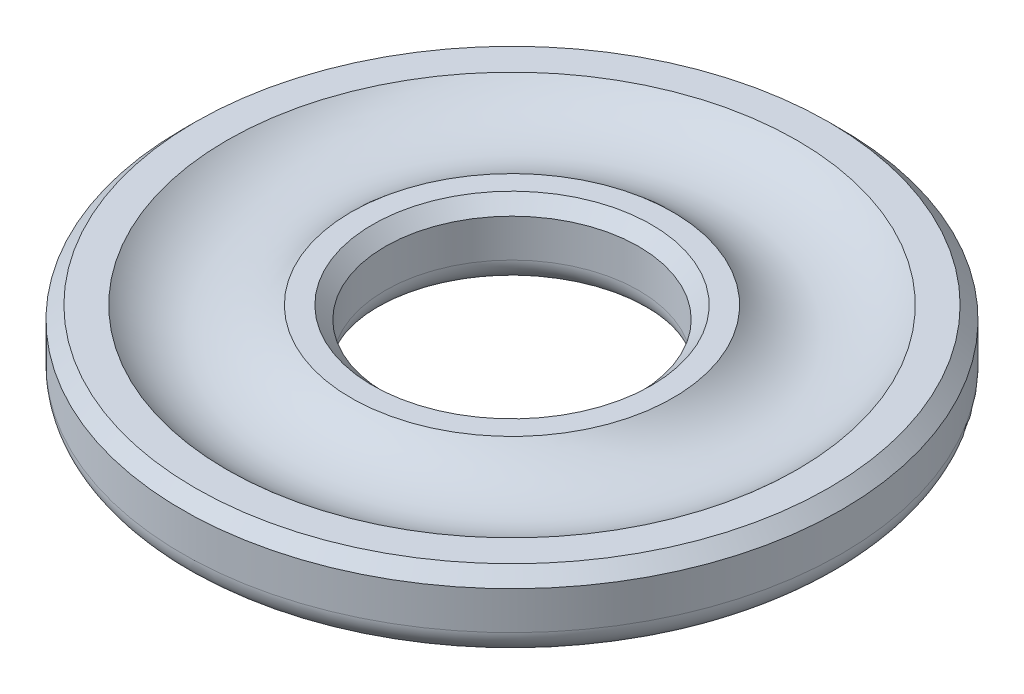
ISO-10303-21;
HEADER;
FILE_DESCRIPTION(('STEP AP214'),'2;1');
FILE_NAME('part.step','',(''),(''),'','','');
FILE_SCHEMA(('AUTOMOTIVE_DESIGN { 1 0 10303 214 1 1 1 1 }'));
ENDSEC;
DATA;
#1=APPLICATION_CONTEXT('core data for automotive mechanical design processes');
#2=APPLICATION_PROTOCOL_DEFINITION('international standard','automotive_design',2000,#1);
#3=PRODUCT_CONTEXT('',#1,'mechanical');
#4=PRODUCT('Part','Part','',(#3));
#5=PRODUCT_RELATED_PRODUCT_CATEGORY('part','',(#4));
#6=PRODUCT_DEFINITION_FORMATION('','',#4);
#7=PRODUCT_DEFINITION_CONTEXT('part definition',#1,'design');
#8=PRODUCT_DEFINITION('design','',#6,#7);
#9=PRODUCT_DEFINITION_SHAPE('','',#8);
#10=(LENGTH_UNIT() NAMED_UNIT(*) SI_UNIT(.MILLI.,.METRE.));
#11=(NAMED_UNIT(*) PLANE_ANGLE_UNIT() SI_UNIT($,.RADIAN.));
#12=(NAMED_UNIT(*) SI_UNIT($,.STERADIAN.) SOLID_ANGLE_UNIT());
#13=UNCERTAINTY_MEASURE_WITH_UNIT(LENGTH_MEASURE(1.E-05),#10,'distance_accuracy_value','');
#14=(GEOMETRIC_REPRESENTATION_CONTEXT(3) GLOBAL_UNCERTAINTY_ASSIGNED_CONTEXT((#13)) GLOBAL_UNIT_ASSIGNED_CONTEXT((#10,
#11,#12)) REPRESENTATION_CONTEXT('',''));
#15=CARTESIAN_POINT('',(0.,0.,0.));
#16=DIRECTION('',(0.,0.,1.));
#17=DIRECTION('',(1.,0.,0.));
#18=AXIS2_PLACEMENT_3D('',#15,#16,#17);
#19=CARTESIAN_POINT('',(0.,5.5,0.));
#20=DIRECTION('',(0.,1.,0.));
#21=DIRECTION('',(-1.,0.,0.));
#22=AXIS2_PLACEMENT_3D('',#19,#20,#21);
#23=CYLINDRICAL_SURFACE('',#22,5.);
#24=CARTESIAN_POINT('',(0.,-4.5,0.));
#25=DIRECTION('',(0.,1.,0.));
#26=DIRECTION('',(-1.,0.,0.));
#27=AXIS2_PLACEMENT_3D('',#24,#25,#26);
#28=CIRCLE('',#27,5.);
#29=CARTESIAN_POINT('',(-5.,-4.5,0.));
#30=VERTEX_POINT('',#29);
#31=EDGE_CURVE('E37',#30,#30,#28,.F.);
#32=ORIENTED_EDGE('',*,*,#31,.T.);
#33=EDGE_LOOP('',(#32));
#34=FACE_BOUND('',#33,.T.);
#35=CARTESIAN_POINT('',(0.,-3.,0.));
#36=DIRECTION('',(0.,-1.,0.));
#37=DIRECTION('',(1.,0.,0.));
#38=AXIS2_PLACEMENT_3D('',#35,#36,#37);
#39=CIRCLE('',#38,5.);
#40=CARTESIAN_POINT('',(5.,-3.,0.));
#41=VERTEX_POINT('',#40);
#42=EDGE_CURVE('E59',#41,#41,#39,.F.);
#43=ORIENTED_EDGE('',*,*,#42,.T.);
#44=EDGE_LOOP('',(#43));
#45=FACE_BOUND('',#44,.T.);
#46=ADVANCED_FACE('F30',(#34,#45),#23,.F.);
#47=CARTESIAN_POINT('',(13.,-5.5,0.));
#48=DIRECTION('',(0.,1.,0.));
#49=DIRECTION('',(-1.,0.,0.));
#50=AXIS2_PLACEMENT_3D('',#47,#48,#49);
#51=PLANE('',#50);
#52=CARTESIAN_POINT('',(0.,-5.5,0.));
#53=DIRECTION('',(0.,1.,0.));
#54=DIRECTION('',(-1.,0.,0.));
#55=AXIS2_PLACEMENT_3D('',#52,#53,#54);
#56=CIRCLE('',#55,6.);
#57=CARTESIAN_POINT('',(-6.,-5.5,0.));
#58=VERTEX_POINT('',#57);
#59=EDGE_CURVE('E41',#58,#58,#56,.T.);
#60=ORIENTED_EDGE('',*,*,#59,.T.);
#61=EDGE_LOOP('',(#60));
#62=FACE_BOUND('',#61,.T.);
#63=CARTESIAN_POINT('',(0.,-5.5,0.));
#64=DIRECTION('',(0.,1.,0.));
#65=DIRECTION('',(-1.,0.,0.));
#66=AXIS2_PLACEMENT_3D('',#63,#64,#65);
#67=CIRCLE('',#66,12.);
#68=CARTESIAN_POINT('',(-12.,-5.5,0.));
#69=VERTEX_POINT('',#68);
#70=EDGE_CURVE('E45',#69,#69,#67,.F.);
#71=ORIENTED_EDGE('',*,*,#70,.T.);
#72=EDGE_LOOP('',(#71));
#73=FACE_BOUND('',#72,.T.);
#74=ADVANCED_FACE('F85',(#62,#73),#51,.F.);
#75=CARTESIAN_POINT('',(0.,5.5,0.));
#76=DIRECTION('',(0.,1.,0.));
#77=DIRECTION('',(-1.,0.,0.));
#78=AXIS2_PLACEMENT_3D('',#75,#76,#77);
#79=CYLINDRICAL_SURFACE('',#78,13.);
#80=CARTESIAN_POINT('',(0.,-4.5,0.));
#81=DIRECTION('',(0.,1.,0.));
#82=DIRECTION('',(-1.,0.,0.));
#83=AXIS2_PLACEMENT_3D('',#80,#81,#82);
#84=CIRCLE('',#83,13.);
#85=CARTESIAN_POINT('',(-13.,-4.5,0.));
#86=VERTEX_POINT('',#85);
#87=EDGE_CURVE('E10',#86,#86,#84,.T.);
#88=ORIENTED_EDGE('',*,*,#87,.T.);
#89=EDGE_LOOP('',(#88));
#90=FACE_BOUND('',#89,.T.);
#91=CARTESIAN_POINT('',(0.,-2.99999999999999,0.));
#92=DIRECTION('',(0.,-1.,0.));
#93=DIRECTION('',(1.,0.,0.));
#94=AXIS2_PLACEMENT_3D('',#91,#92,#93);
#95=CIRCLE('',#94,13.);
#96=CARTESIAN_POINT('',(13.,-2.99999999999999,0.));
#97=VERTEX_POINT('',#96);
#98=EDGE_CURVE('E50',#97,#97,#95,.T.);
#99=ORIENTED_EDGE('',*,*,#98,.T.);
#100=EDGE_LOOP('',(#99));
#101=FACE_BOUND('',#100,.T.);
#102=ADVANCED_FACE('F79',(#90,#101),#79,.T.);
#103=CARTESIAN_POINT('',(11.2494897427832,-2.5,0.));
#104=DIRECTION('',(0.,-1.,0.));
#105=DIRECTION('',(1.,0.,0.));
#106=AXIS2_PLACEMENT_3D('',#103,#104,#105);
#107=PLANE('',#106);
#108=CARTESIAN_POINT('',(0.,-2.5,0.));
#109=DIRECTION('',(0.,-1.,0.));
#110=DIRECTION('',(1.,0.,0.));
#111=AXIS2_PLACEMENT_3D('',#108,#109,#110);
#112=CIRCLE('',#111,12.5);
#113=CARTESIAN_POINT('',(12.5,-2.5,0.));
#114=VERTEX_POINT('',#113);
#115=EDGE_CURVE('E53',#114,#114,#112,.F.);
#116=ORIENTED_EDGE('',*,*,#115,.T.);
#117=EDGE_LOOP('',(#116));
#118=FACE_BOUND('',#117,.T.);
#119=CARTESIAN_POINT('',(0.,-2.5,0.));
#120=DIRECTION('',(0.,1.,0.));
#121=DIRECTION('',(-1.,0.,0.));
#122=AXIS2_PLACEMENT_3D('',#119,#120,#121);
#123=CIRCLE('',#122,11.2494897427832);
#124=CARTESIAN_POINT('',(-11.2494897427832,-2.5,0.));
#125=VERTEX_POINT('',#124);
#126=EDGE_CURVE('E62',#125,#125,#123,.T.);
#127=ORIENTED_EDGE('',*,*,#126,.F.);
#128=EDGE_LOOP('',(#127));
#129=FACE_BOUND('',#128,.T.);
#130=ADVANCED_FACE('F74',(#118,#129),#107,.F.);
#131=CARTESIAN_POINT('',(0.,0.,0.));
#132=DIRECTION('',(0.,1.,0.));
#133=DIRECTION('',(-1.,0.,0.));
#134=AXIS2_PLACEMENT_3D('',#131,#132,#133);
#135=TOROIDAL_SURFACE('',#134,8.8,3.5);
#136=CARTESIAN_POINT('',(0.,-2.5,0.));
#137=DIRECTION('',(0.,1.,0.));
#138=DIRECTION('',(-1.,0.,0.));
#139=AXIS2_PLACEMENT_3D('',#136,#137,#138);
#140=CIRCLE('',#139,6.35051025721682);
#141=CARTESIAN_POINT('',(-6.35051025721682,-2.5,0.));
#142=VERTEX_POINT('',#141);
#143=EDGE_CURVE('E65',#142,#142,#140,.T.);
#144=ORIENTED_EDGE('',*,*,#143,.F.);
#145=EDGE_LOOP('',(#144));
#146=FACE_BOUND('',#145,.T.);
#147=ORIENTED_EDGE('',*,*,#126,.T.);
#148=EDGE_LOOP('',(#147));
#149=FACE_BOUND('',#148,.T.);
#150=ADVANCED_FACE('F71',(#146,#149),#135,.F.);
#151=CARTESIAN_POINT('',(5.,-2.5,0.));
#152=DIRECTION('',(0.,-1.,0.));
#153=DIRECTION('',(1.,0.,0.));
#154=AXIS2_PLACEMENT_3D('',#151,#152,#153);
#155=PLANE('',#154);
#156=CARTESIAN_POINT('',(0.,-2.5,0.));
#157=DIRECTION('',(0.,-1.,0.));
#158=DIRECTION('',(1.,0.,0.));
#159=AXIS2_PLACEMENT_3D('',#156,#157,#158);
#160=CIRCLE('',#159,5.5);
#161=CARTESIAN_POINT('',(5.5,-2.5,0.));
#162=VERTEX_POINT('',#161);
#163=EDGE_CURVE('E56',#162,#162,#160,.T.);
#164=ORIENTED_EDGE('',*,*,#163,.T.);
#165=EDGE_LOOP('',(#164));
#166=FACE_BOUND('',#165,.T.);
#167=ORIENTED_EDGE('',*,*,#143,.T.);
#168=EDGE_LOOP('',(#167));
#169=FACE_BOUND('',#168,.T.);
#170=ADVANCED_FACE('F69',(#166,#169),#155,.F.);
#171=CARTESIAN_POINT('',(0.,-3.,0.));
#172=DIRECTION('',(0.,1.,0.));
#173=DIRECTION('',(-1.,0.,0.));
#174=AXIS2_PLACEMENT_3D('',#171,#172,#173);
#175=CONICAL_SURFACE('',#174,5.,0.785398163397454);
#176=ORIENTED_EDGE('',*,*,#163,.F.);
#177=EDGE_LOOP('',(#176));
#178=FACE_BOUND('',#177,.T.);
#179=ORIENTED_EDGE('',*,*,#42,.F.);
#180=EDGE_LOOP('',(#179));
#181=FACE_BOUND('',#180,.T.);
#182=ADVANCED_FACE('F96',(#178,#181),#175,.F.);
#183=CARTESIAN_POINT('',(0.,-2.5,0.));
#184=DIRECTION('',(0.,-1.,0.));
#185=DIRECTION('',(1.,0.,0.));
#186=AXIS2_PLACEMENT_3D('',#183,#184,#185);
#187=CONICAL_SURFACE('',#186,12.5,0.785398163397453);
#188=ORIENTED_EDGE('',*,*,#98,.F.);
#189=EDGE_LOOP('',(#188));
#190=FACE_BOUND('',#189,.T.);
#191=ORIENTED_EDGE('',*,*,#115,.F.);
#192=EDGE_LOOP('',(#191));
#193=FACE_BOUND('',#192,.T.);
#194=ADVANCED_FACE('F99',(#190,#193),#187,.T.);
#195=CARTESIAN_POINT('',(0.,-4.5,0.));
#196=DIRECTION('',(0.,1.,0.));
#197=DIRECTION('',(-1.,0.,0.));
#198=AXIS2_PLACEMENT_3D('',#195,#196,#197);
#199=TOROIDAL_SURFACE('',#198,6.,1.);
#200=ORIENTED_EDGE('',*,*,#31,.F.);
#201=EDGE_LOOP('',(#200));
#202=FACE_BOUND('',#201,.T.);
#203=ORIENTED_EDGE('',*,*,#59,.F.);
#204=EDGE_LOOP('',(#203));
#205=FACE_BOUND('',#204,.T.);
#206=ADVANCED_FACE('F102',(#202,#205),#199,.T.);
#207=CARTESIAN_POINT('',(0.,-4.5,0.));
#208=DIRECTION('',(0.,1.,0.));
#209=DIRECTION('',(-1.,0.,0.));
#210=AXIS2_PLACEMENT_3D('',#207,#208,#209);
#211=TOROIDAL_SURFACE('',#210,12.,1.);
#212=ORIENTED_EDGE('',*,*,#70,.F.);
#213=EDGE_LOOP('',(#212));
#214=FACE_BOUND('',#213,.T.);
#215=ORIENTED_EDGE('',*,*,#87,.F.);
#216=EDGE_LOOP('',(#215));
#217=FACE_BOUND('',#216,.T.);
#218=ADVANCED_FACE('F32',(#214,#217),#211,.T.);
#219=CLOSED_SHELL('',(#46,#74,#102,#130,#150,#170,#182,#194,#206,#218));
#220=MANIFOLD_SOLID_BREP('B2',#219);
#221=ADVANCED_BREP_SHAPE_REPRESENTATION('',(#18,#220),#14);
#222=SHAPE_DEFINITION_REPRESENTATION(#9,#221);
ENDSEC;
END-ISO-10303-21;
